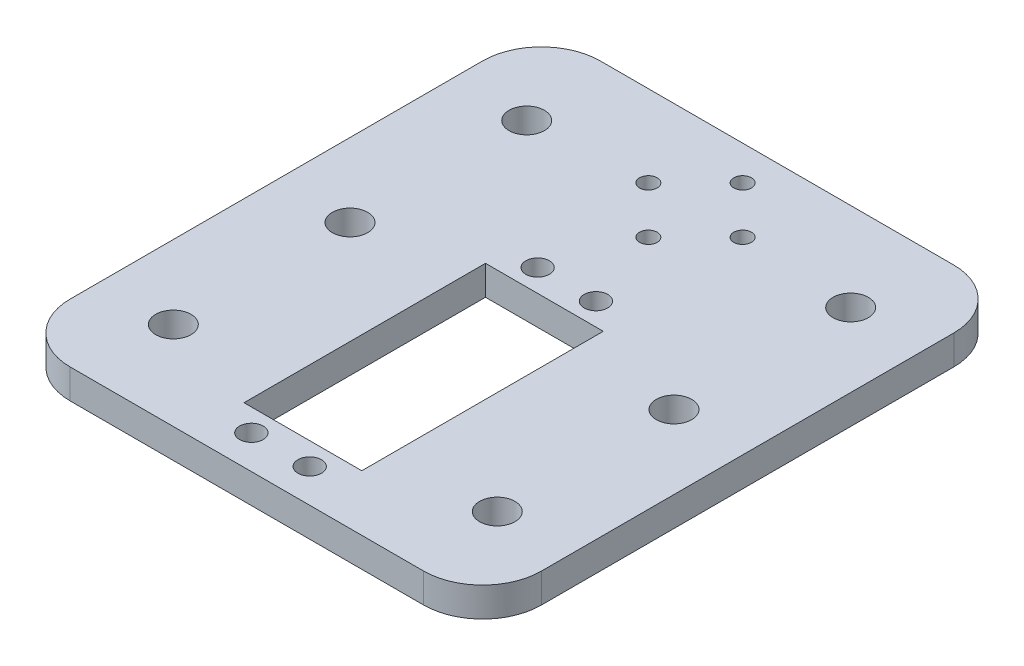
ISO-10303-21;
HEADER;
FILE_DESCRIPTION(('STEP AP214'),'2;1');
FILE_NAME('part.step','',(''),(''),'','','');
FILE_SCHEMA(('AUTOMOTIVE_DESIGN { 1 0 10303 214 1 1 1 1 }'));
ENDSEC;
DATA;
#1=APPLICATION_CONTEXT('core data for automotive mechanical design processes');
#2=APPLICATION_PROTOCOL_DEFINITION('international standard','automotive_design',2000,#1);
#3=PRODUCT_CONTEXT('',#1,'mechanical');
#4=PRODUCT('Part','Part','',(#3));
#5=PRODUCT_RELATED_PRODUCT_CATEGORY('part','',(#4));
#6=PRODUCT_DEFINITION_FORMATION('','',#4);
#7=PRODUCT_DEFINITION_CONTEXT('part definition',#1,'design');
#8=PRODUCT_DEFINITION('design','',#6,#7);
#9=PRODUCT_DEFINITION_SHAPE('','',#8);
#10=(LENGTH_UNIT() NAMED_UNIT(*) SI_UNIT(.MILLI.,.METRE.));
#11=(NAMED_UNIT(*) PLANE_ANGLE_UNIT() SI_UNIT($,.RADIAN.));
#12=(NAMED_UNIT(*) SI_UNIT($,.STERADIAN.) SOLID_ANGLE_UNIT());
#13=UNCERTAINTY_MEASURE_WITH_UNIT(LENGTH_MEASURE(1.E-05),#10,'distance_accuracy_value','');
#14=(GEOMETRIC_REPRESENTATION_CONTEXT(3) GLOBAL_UNCERTAINTY_ASSIGNED_CONTEXT((#13)) GLOBAL_UNIT_ASSIGNED_CONTEXT((#10,
#11,#12)) REPRESENTATION_CONTEXT('',''));
#15=CARTESIAN_POINT('',(0.,0.,0.));
#16=DIRECTION('',(0.,0.,1.));
#17=DIRECTION('',(1.,0.,0.));
#18=AXIS2_PLACEMENT_3D('',#15,#16,#17);
#19=CARTESIAN_POINT('',(0.,5.,0.));
#20=DIRECTION('',(0.,1.,0.));
#21=DIRECTION('',(0.,0.,1.));
#22=AXIS2_PLACEMENT_3D('',#19,#20,#21);
#23=PLANE('',#22);
#24=CARTESIAN_POINT('',(0.,5.,-54.15));
#25=DIRECTION('',(0.,1.,0.));
#26=DIRECTION('',(0.,0.,1.));
#27=AXIS2_PLACEMENT_3D('',#24,#25,#26);
#28=CIRCLE('',#27,1.5);
#29=CARTESIAN_POINT('',(0.,5.,-52.65));
#30=VERTEX_POINT('',#29);
#31=EDGE_CURVE('E613',#30,#30,#28,.T.);
#32=ORIENTED_EDGE('',*,*,#31,.F.);
#33=EDGE_LOOP('',(#32));
#34=FACE_BOUND('',#33,.T.);
#35=CARTESIAN_POINT('',(7.99999999999997,5.,-46.15));
#36=DIRECTION('',(0.,1.,0.));
#37=DIRECTION('',(0.,0.,1.));
#38=AXIS2_PLACEMENT_3D('',#35,#36,#37);
#39=CIRCLE('',#38,1.49999999999995);
#40=CARTESIAN_POINT('',(7.99999999999997,5.,-44.65));
#41=VERTEX_POINT('',#40);
#42=EDGE_CURVE('E640',#41,#41,#39,.T.);
#43=ORIENTED_EDGE('',*,*,#42,.F.);
#44=EDGE_LOOP('',(#43));
#45=FACE_BOUND('',#44,.T.);
#46=CARTESIAN_POINT('',(0.,5.,-38.15));
#47=DIRECTION('',(0.,1.,0.));
#48=DIRECTION('',(0.,0.,1.));
#49=AXIS2_PLACEMENT_3D('',#46,#47,#48);
#50=CIRCLE('',#49,1.49999999999984);
#51=CARTESIAN_POINT('',(0.,5.,-36.6500000000002));
#52=VERTEX_POINT('',#51);
#53=EDGE_CURVE('E634',#52,#52,#50,.T.);
#54=ORIENTED_EDGE('',*,*,#53,.F.);
#55=EDGE_LOOP('',(#54));
#56=FACE_BOUND('',#55,.T.);
#57=CARTESIAN_POINT('',(-8.00000000000004,5.,-46.15));
#58=DIRECTION('',(0.,1.,0.));
#59=DIRECTION('',(0.,0.,1.));
#60=AXIS2_PLACEMENT_3D('',#57,#58,#59);
#61=CIRCLE('',#60,1.49999999999995);
#62=CARTESIAN_POINT('',(-8.00000000000004,5.,-44.6500000000001));
#63=VERTEX_POINT('',#62);
#64=EDGE_CURVE('E628',#63,#63,#61,.T.);
#65=ORIENTED_EDGE('',*,*,#64,.F.);
#66=EDGE_LOOP('',(#65));
#67=FACE_BOUND('',#66,.T.);
#68=CARTESIAN_POINT('',(27.4999999999999,5.,-45.));
#69=DIRECTION('',(0.,1.,0.));
#70=DIRECTION('',(0.,0.,1.));
#71=AXIS2_PLACEMENT_3D('',#68,#69,#70);
#72=CIRCLE('',#71,3.);
#73=CARTESIAN_POINT('',(27.4999999999999,5.,-42.));
#74=VERTEX_POINT('',#73);
#75=EDGE_CURVE('E159',#74,#74,#72,.T.);
#76=ORIENTED_EDGE('',*,*,#75,.F.);
#77=EDGE_LOOP('',(#76));
#78=FACE_BOUND('',#77,.T.);
#79=CARTESIAN_POINT('',(4.95,5.,24.3));
#80=DIRECTION('',(0.,1.,0.));
#81=DIRECTION('',(0.,0.,-1.));
#82=AXIS2_PLACEMENT_3D('',#79,#80,#81);
#83=CIRCLE('',#82,2.);
#84=CARTESIAN_POINT('',(4.95,5.,22.3));
#85=VERTEX_POINT('',#84);
#86=EDGE_CURVE('E176',#85,#85,#83,.T.);
#87=ORIENTED_EDGE('',*,*,#86,.F.);
#88=EDGE_LOOP('',(#87));
#89=FACE_BOUND('',#88,.T.);
#90=CARTESIAN_POINT('',(4.95,5.,-24.3));
#91=DIRECTION('',(0.,1.,0.));
#92=DIRECTION('',(0.,0.,1.));
#93=AXIS2_PLACEMENT_3D('',#90,#91,#92);
#94=CIRCLE('',#93,2.);
#95=CARTESIAN_POINT('',(4.95,5.,-22.3));
#96=VERTEX_POINT('',#95);
#97=EDGE_CURVE('E188',#96,#96,#94,.T.);
#98=ORIENTED_EDGE('',*,*,#97,.F.);
#99=EDGE_LOOP('',(#98));
#100=FACE_BOUND('',#99,.T.);
#101=CARTESIAN_POINT('',(-27.5,5.,15.));
#102=DIRECTION('',(0.,1.,0.));
#103=DIRECTION('',(0.,0.,-1.));
#104=AXIS2_PLACEMENT_3D('',#101,#102,#103);
#105=CIRCLE('',#104,3.);
#106=CARTESIAN_POINT('',(-27.5,5.,12.));
#107=VERTEX_POINT('',#106);
#108=EDGE_CURVE('E200',#107,#107,#105,.T.);
#109=ORIENTED_EDGE('',*,*,#108,.F.);
#110=EDGE_LOOP('',(#109));
#111=FACE_BOUND('',#110,.T.);
#112=CARTESIAN_POINT('',(27.5,5.,-15.));
#113=DIRECTION('',(0.,1.,0.));
#114=DIRECTION('',(0.,0.,1.));
#115=AXIS2_PLACEMENT_3D('',#112,#113,#114);
#116=CIRCLE('',#115,3.);
#117=CARTESIAN_POINT('',(27.5,5.,-12.));
#118=VERTEX_POINT('',#117);
#119=EDGE_CURVE('E212',#118,#118,#116,.T.);
#120=ORIENTED_EDGE('',*,*,#119,.F.);
#121=EDGE_LOOP('',(#120));
#122=FACE_BOUND('',#121,.T.);
#123=DIRECTION('',(-1.,0.,0.));
#124=VECTOR('',#123,1.);
#125=CARTESIAN_POINT('',(-40.,5.,-60.));
#126=LINE('',#125,#124);
#127=CARTESIAN_POINT('',(30.,5.,-60.));
#128=VERTEX_POINT('',#127);
#129=CARTESIAN_POINT('',(-30.,5.,-60.));
#130=VERTEX_POINT('',#129);
#131=EDGE_CURVE('E218',#128,#130,#126,.T.);
#132=ORIENTED_EDGE('',*,*,#131,.T.);
#133=CARTESIAN_POINT('',(-30.,5.,-50.));
#134=DIRECTION('',(0.,1.,0.));
#135=DIRECTION('',(0.,0.,1.));
#136=AXIS2_PLACEMENT_3D('',#133,#134,#135);
#137=CIRCLE('',#136,10.);
#138=CARTESIAN_POINT('',(-40.,5.,-50.));
#139=VERTEX_POINT('',#138);
#140=EDGE_CURVE('E261',#130,#139,#137,.T.);
#141=ORIENTED_EDGE('',*,*,#140,.T.);
#142=DIRECTION('',(0.,0.,1.));
#143=VECTOR('',#142,1.);
#144=CARTESIAN_POINT('',(-40.,5.,30.));
#145=LINE('',#144,#143);
#146=CARTESIAN_POINT('',(-40.,5.,20.));
#147=VERTEX_POINT('',#146);
#148=EDGE_CURVE('E221',#139,#147,#145,.T.);
#149=ORIENTED_EDGE('',*,*,#148,.T.);
#150=CARTESIAN_POINT('',(-30.,5.,20.));
#151=DIRECTION('',(0.,1.,0.));
#152=DIRECTION('',(0.,0.,1.));
#153=AXIS2_PLACEMENT_3D('',#150,#151,#152);
#154=CIRCLE('',#153,10.);
#155=CARTESIAN_POINT('',(-30.,5.,30.));
#156=VERTEX_POINT('',#155);
#157=EDGE_CURVE('E256',#147,#156,#154,.T.);
#158=ORIENTED_EDGE('',*,*,#157,.T.);
#159=DIRECTION('',(1.,0.,0.));
#160=VECTOR('',#159,1.);
#161=CARTESIAN_POINT('',(-40.,5.,30.));
#162=LINE('',#161,#160);
#163=CARTESIAN_POINT('',(30.,5.,30.));
#164=VERTEX_POINT('',#163);
#165=EDGE_CURVE('E225',#156,#164,#162,.T.);
#166=ORIENTED_EDGE('',*,*,#165,.T.);
#167=CARTESIAN_POINT('',(30.,5.,20.));
#168=DIRECTION('',(0.,1.,0.));
#169=DIRECTION('',(0.,0.,1.));
#170=AXIS2_PLACEMENT_3D('',#167,#168,#169);
#171=CIRCLE('',#170,10.);
#172=CARTESIAN_POINT('',(40.,5.,20.));
#173=VERTEX_POINT('',#172);
#174=EDGE_CURVE('E57',#164,#173,#171,.T.);
#175=ORIENTED_EDGE('',*,*,#174,.T.);
#176=DIRECTION('',(0.,0.,-1.));
#177=VECTOR('',#176,1.);
#178=CARTESIAN_POINT('',(40.,5.,30.));
#179=LINE('',#178,#177);
#180=CARTESIAN_POINT('',(40.,5.,-50.));
#181=VERTEX_POINT('',#180);
#182=EDGE_CURVE('E227',#173,#181,#179,.T.);
#183=ORIENTED_EDGE('',*,*,#182,.T.);
#184=CARTESIAN_POINT('',(30.,5.,-50.));
#185=DIRECTION('',(0.,1.,0.));
#186=DIRECTION('',(0.,0.,1.));
#187=AXIS2_PLACEMENT_3D('',#184,#185,#186);
#188=CIRCLE('',#187,10.);
#189=EDGE_CURVE('E259',#181,#128,#188,.T.);
#190=ORIENTED_EDGE('',*,*,#189,.T.);
#191=EDGE_LOOP('',(#132,#141,#149,#158,#166,#175,#183,#190));
#192=FACE_BOUND('',#191,.T.);
#193=CARTESIAN_POINT('',(27.5,5.,15.));
#194=DIRECTION('',(0.,1.,0.));
#195=DIRECTION('',(0.,0.,1.));
#196=AXIS2_PLACEMENT_3D('',#193,#194,#195);
#197=CIRCLE('',#196,3.);
#198=CARTESIAN_POINT('',(27.5,5.,18.));
#199=VERTEX_POINT('',#198);
#200=EDGE_CURVE('E206',#199,#199,#197,.T.);
#201=ORIENTED_EDGE('',*,*,#200,.F.);
#202=EDGE_LOOP('',(#201));
#203=FACE_BOUND('',#202,.T.);
#204=CARTESIAN_POINT('',(-27.5,5.,-15.));
#205=DIRECTION('',(0.,1.,0.));
#206=DIRECTION('',(0.,0.,-1.));
#207=AXIS2_PLACEMENT_3D('',#204,#205,#206);
#208=CIRCLE('',#207,3.);
#209=CARTESIAN_POINT('',(-27.5,5.,-18.));
#210=VERTEX_POINT('',#209);
#211=EDGE_CURVE('E194',#210,#210,#208,.T.);
#212=ORIENTED_EDGE('',*,*,#211,.F.);
#213=EDGE_LOOP('',(#212));
#214=FACE_BOUND('',#213,.T.);
#215=CARTESIAN_POINT('',(-4.95,5.,-24.3));
#216=DIRECTION('',(0.,1.,0.));
#217=DIRECTION('',(0.,0.,-1.));
#218=AXIS2_PLACEMENT_3D('',#215,#216,#217);
#219=CIRCLE('',#218,2.);
#220=CARTESIAN_POINT('',(-4.95,5.,-26.3));
#221=VERTEX_POINT('',#220);
#222=EDGE_CURVE('E182',#221,#221,#219,.T.);
#223=ORIENTED_EDGE('',*,*,#222,.F.);
#224=EDGE_LOOP('',(#223));
#225=FACE_BOUND('',#224,.T.);
#226=CARTESIAN_POINT('',(-4.95,5.,24.3));
#227=DIRECTION('',(0.,1.,0.));
#228=DIRECTION('',(0.,0.,1.));
#229=AXIS2_PLACEMENT_3D('',#226,#227,#228);
#230=CIRCLE('',#229,2.);
#231=CARTESIAN_POINT('',(-4.95,5.,26.3));
#232=VERTEX_POINT('',#231);
#233=EDGE_CURVE('E170',#232,#232,#230,.T.);
#234=ORIENTED_EDGE('',*,*,#233,.F.);
#235=EDGE_LOOP('',(#234));
#236=FACE_BOUND('',#235,.T.);
#237=DIRECTION('',(-1.,0.,0.));
#238=VECTOR('',#237,1.);
#239=CARTESIAN_POINT('',(-10.,5.,-20.5));
#240=LINE('',#239,#238);
#241=CARTESIAN_POINT('',(10.,5.,-20.5));
#242=VERTEX_POINT('',#241);
#243=CARTESIAN_POINT('',(-10.,5.,-20.5));
#244=VERTEX_POINT('',#243);
#245=EDGE_CURVE('E136',#242,#244,#240,.T.);
#246=ORIENTED_EDGE('',*,*,#245,.F.);
#247=DIRECTION('',(0.,0.,-1.));
#248=VECTOR('',#247,1.);
#249=CARTESIAN_POINT('',(10.,5.,20.5));
#250=LINE('',#249,#248);
#251=CARTESIAN_POINT('',(10.,5.,20.5));
#252=VERTEX_POINT('',#251);
#253=EDGE_CURVE('E126',#252,#242,#250,.T.);
#254=ORIENTED_EDGE('',*,*,#253,.F.);
#255=DIRECTION('',(1.,0.,0.));
#256=VECTOR('',#255,1.);
#257=CARTESIAN_POINT('',(-10.,5.,20.5));
#258=LINE('',#257,#256);
#259=CARTESIAN_POINT('',(-10.,5.,20.5));
#260=VERTEX_POINT('',#259);
#261=EDGE_CURVE('E152',#260,#252,#258,.T.);
#262=ORIENTED_EDGE('',*,*,#261,.F.);
#263=DIRECTION('',(0.,0.,1.));
#264=VECTOR('',#263,1.);
#265=CARTESIAN_POINT('',(-10.,5.,20.5));
#266=LINE('',#265,#264);
#267=EDGE_CURVE('E150',#244,#260,#266,.T.);
#268=ORIENTED_EDGE('',*,*,#267,.F.);
#269=EDGE_LOOP('',(#246,#254,#262,#268));
#270=FACE_BOUND('',#269,.T.);
#271=CARTESIAN_POINT('',(-27.5000000000001,5.,-45.));
#272=DIRECTION('',(0.,1.,0.));
#273=DIRECTION('',(0.,0.,-1.));
#274=AXIS2_PLACEMENT_3D('',#271,#272,#273);
#275=CIRCLE('',#274,3.);
#276=CARTESIAN_POINT('',(-27.5000000000001,5.,-48.));
#277=VERTEX_POINT('',#276);
#278=EDGE_CURVE('E612',#277,#277,#275,.T.);
#279=ORIENTED_EDGE('',*,*,#278,.F.);
#280=EDGE_LOOP('',(#279));
#281=FACE_BOUND('',#280,.T.);
#282=ADVANCED_FACE('F35',(#34,#45,#56,#67,#78,#89,#100,#111,#122,#192,#203,#214,#225,#236,#270,
#281),#23,.T.);
#283=CARTESIAN_POINT('',(0.,0.,0.));
#284=DIRECTION('',(0.,1.,0.));
#285=DIRECTION('',(0.,0.,1.));
#286=AXIS2_PLACEMENT_3D('',#283,#284,#285);
#287=PLANE('',#286);
#288=CARTESIAN_POINT('',(0.,0.,-54.15));
#289=DIRECTION('',(0.,1.,0.));
#290=DIRECTION('',(0.,0.,1.));
#291=AXIS2_PLACEMENT_3D('',#288,#289,#290);
#292=CIRCLE('',#291,1.5);
#293=CARTESIAN_POINT('',(0.,0.,-52.65));
#294=VERTEX_POINT('',#293);
#295=EDGE_CURVE('E617',#294,#294,#292,.T.);
#296=ORIENTED_EDGE('',*,*,#295,.T.);
#297=EDGE_LOOP('',(#296));
#298=FACE_BOUND('',#297,.T.);
#299=CARTESIAN_POINT('',(7.99999999999997,0.,-46.15));
#300=DIRECTION('',(0.,1.,0.));
#301=DIRECTION('',(0.,0.,1.));
#302=AXIS2_PLACEMENT_3D('',#299,#300,#301);
#303=CIRCLE('',#302,1.49999999999995);
#304=CARTESIAN_POINT('',(7.99999999999997,0.,-44.65));
#305=VERTEX_POINT('',#304);
#306=EDGE_CURVE('E637',#305,#305,#303,.T.);
#307=ORIENTED_EDGE('',*,*,#306,.T.);
#308=EDGE_LOOP('',(#307));
#309=FACE_BOUND('',#308,.T.);
#310=CARTESIAN_POINT('',(0.,0.,-38.15));
#311=DIRECTION('',(0.,1.,0.));
#312=DIRECTION('',(0.,0.,1.));
#313=AXIS2_PLACEMENT_3D('',#310,#311,#312);
#314=CIRCLE('',#313,1.49999999999984);
#315=CARTESIAN_POINT('',(0.,0.,-36.6500000000002));
#316=VERTEX_POINT('',#315);
#317=EDGE_CURVE('E631',#316,#316,#314,.T.);
#318=ORIENTED_EDGE('',*,*,#317,.T.);
#319=EDGE_LOOP('',(#318));
#320=FACE_BOUND('',#319,.T.);
#321=CARTESIAN_POINT('',(-8.00000000000004,0.,-46.15));
#322=DIRECTION('',(0.,1.,0.));
#323=DIRECTION('',(0.,0.,1.));
#324=AXIS2_PLACEMENT_3D('',#321,#322,#323);
#325=CIRCLE('',#324,1.49999999999995);
#326=CARTESIAN_POINT('',(-8.00000000000004,0.,-44.6500000000001));
#327=VERTEX_POINT('',#326);
#328=EDGE_CURVE('E625',#327,#327,#325,.T.);
#329=ORIENTED_EDGE('',*,*,#328,.T.);
#330=EDGE_LOOP('',(#329));
#331=FACE_BOUND('',#330,.T.);
#332=CARTESIAN_POINT('',(-4.95,0.,24.3));
#333=DIRECTION('',(0.,1.,0.));
#334=DIRECTION('',(0.,0.,1.));
#335=AXIS2_PLACEMENT_3D('',#332,#333,#334);
#336=CIRCLE('',#335,2.);
#337=CARTESIAN_POINT('',(-4.95,0.,26.3));
#338=VERTEX_POINT('',#337);
#339=EDGE_CURVE('E144',#338,#338,#336,.T.);
#340=ORIENTED_EDGE('',*,*,#339,.T.);
#341=EDGE_LOOP('',(#340));
#342=FACE_BOUND('',#341,.T.);
#343=CARTESIAN_POINT('',(4.95,0.,24.3));
#344=DIRECTION('',(0.,1.,0.));
#345=DIRECTION('',(0.,0.,-1.));
#346=AXIS2_PLACEMENT_3D('',#343,#344,#345);
#347=CIRCLE('',#346,2.);
#348=CARTESIAN_POINT('',(4.95,0.,22.3));
#349=VERTEX_POINT('',#348);
#350=EDGE_CURVE('E173',#349,#349,#347,.T.);
#351=ORIENTED_EDGE('',*,*,#350,.T.);
#352=EDGE_LOOP('',(#351));
#353=FACE_BOUND('',#352,.T.);
#354=CARTESIAN_POINT('',(-4.95,0.,-24.3));
#355=DIRECTION('',(0.,1.,0.));
#356=DIRECTION('',(0.,0.,-1.));
#357=AXIS2_PLACEMENT_3D('',#354,#355,#356);
#358=CIRCLE('',#357,2.);
#359=CARTESIAN_POINT('',(-4.95,0.,-26.3));
#360=VERTEX_POINT('',#359);
#361=EDGE_CURVE('E179',#360,#360,#358,.T.);
#362=ORIENTED_EDGE('',*,*,#361,.T.);
#363=EDGE_LOOP('',(#362));
#364=FACE_BOUND('',#363,.T.);
#365=CARTESIAN_POINT('',(4.95,0.,-24.3));
#366=DIRECTION('',(0.,1.,0.));
#367=DIRECTION('',(0.,0.,1.));
#368=AXIS2_PLACEMENT_3D('',#365,#366,#367);
#369=CIRCLE('',#368,2.);
#370=CARTESIAN_POINT('',(4.95,0.,-22.3));
#371=VERTEX_POINT('',#370);
#372=EDGE_CURVE('E185',#371,#371,#369,.T.);
#373=ORIENTED_EDGE('',*,*,#372,.T.);
#374=EDGE_LOOP('',(#373));
#375=FACE_BOUND('',#374,.T.);
#376=CARTESIAN_POINT('',(-27.5,0.,-15.));
#377=DIRECTION('',(0.,1.,0.));
#378=DIRECTION('',(0.,0.,-1.));
#379=AXIS2_PLACEMENT_3D('',#376,#377,#378);
#380=CIRCLE('',#379,3.);
#381=CARTESIAN_POINT('',(-27.5,0.,-18.));
#382=VERTEX_POINT('',#381);
#383=EDGE_CURVE('E191',#382,#382,#380,.T.);
#384=ORIENTED_EDGE('',*,*,#383,.T.);
#385=EDGE_LOOP('',(#384));
#386=FACE_BOUND('',#385,.T.);
#387=CARTESIAN_POINT('',(-27.5,0.,15.));
#388=DIRECTION('',(0.,1.,0.));
#389=DIRECTION('',(0.,0.,-1.));
#390=AXIS2_PLACEMENT_3D('',#387,#388,#389);
#391=CIRCLE('',#390,3.);
#392=CARTESIAN_POINT('',(-27.5,0.,12.));
#393=VERTEX_POINT('',#392);
#394=EDGE_CURVE('E197',#393,#393,#391,.T.);
#395=ORIENTED_EDGE('',*,*,#394,.T.);
#396=EDGE_LOOP('',(#395));
#397=FACE_BOUND('',#396,.T.);
#398=CARTESIAN_POINT('',(27.5,0.,15.));
#399=DIRECTION('',(0.,1.,0.));
#400=DIRECTION('',(0.,0.,1.));
#401=AXIS2_PLACEMENT_3D('',#398,#399,#400);
#402=CIRCLE('',#401,3.);
#403=CARTESIAN_POINT('',(27.5,0.,18.));
#404=VERTEX_POINT('',#403);
#405=EDGE_CURVE('E203',#404,#404,#402,.T.);
#406=ORIENTED_EDGE('',*,*,#405,.T.);
#407=EDGE_LOOP('',(#406));
#408=FACE_BOUND('',#407,.T.);
#409=CARTESIAN_POINT('',(27.5,0.,-15.));
#410=DIRECTION('',(0.,1.,0.));
#411=DIRECTION('',(0.,0.,1.));
#412=AXIS2_PLACEMENT_3D('',#409,#410,#411);
#413=CIRCLE('',#412,3.);
#414=CARTESIAN_POINT('',(27.5,0.,-12.));
#415=VERTEX_POINT('',#414);
#416=EDGE_CURVE('E209',#415,#415,#413,.T.);
#417=ORIENTED_EDGE('',*,*,#416,.T.);
#418=EDGE_LOOP('',(#417));
#419=FACE_BOUND('',#418,.T.);
#420=DIRECTION('',(0.,0.,1.));
#421=VECTOR('',#420,1.);
#422=CARTESIAN_POINT('',(-40.,0.,30.));
#423=LINE('',#422,#421);
#424=CARTESIAN_POINT('',(-40.,0.,-50.));
#425=VERTEX_POINT('',#424);
#426=CARTESIAN_POINT('',(-40.,0.,20.));
#427=VERTEX_POINT('',#426);
#428=EDGE_CURVE('E232',#425,#427,#423,.T.);
#429=ORIENTED_EDGE('',*,*,#428,.F.);
#430=CARTESIAN_POINT('',(-30.,0.,-50.));
#431=DIRECTION('',(0.,1.,0.));
#432=DIRECTION('',(0.,0.,1.));
#433=AXIS2_PLACEMENT_3D('',#430,#431,#432);
#434=CIRCLE('',#433,10.);
#435=CARTESIAN_POINT('',(-30.,0.,-60.));
#436=VERTEX_POINT('',#435);
#437=EDGE_CURVE('E249',#425,#436,#434,.F.);
#438=ORIENTED_EDGE('',*,*,#437,.T.);
#439=DIRECTION('',(-1.,0.,0.));
#440=VECTOR('',#439,1.);
#441=CARTESIAN_POINT('',(-40.,0.,-60.));
#442=LINE('',#441,#440);
#443=CARTESIAN_POINT('',(30.,0.,-60.));
#444=VERTEX_POINT('',#443);
#445=EDGE_CURVE('E215',#444,#436,#442,.T.);
#446=ORIENTED_EDGE('',*,*,#445,.F.);
#447=CARTESIAN_POINT('',(30.,0.,-50.));
#448=DIRECTION('',(0.,1.,0.));
#449=DIRECTION('',(0.,0.,1.));
#450=AXIS2_PLACEMENT_3D('',#447,#448,#449);
#451=CIRCLE('',#450,10.);
#452=CARTESIAN_POINT('',(40.,0.,-50.));
#453=VERTEX_POINT('',#452);
#454=EDGE_CURVE('E247',#444,#453,#451,.F.);
#455=ORIENTED_EDGE('',*,*,#454,.T.);
#456=DIRECTION('',(0.,0.,-1.));
#457=VECTOR('',#456,1.);
#458=CARTESIAN_POINT('',(40.,0.,30.));
#459=LINE('',#458,#457);
#460=CARTESIAN_POINT('',(40.,0.,20.));
#461=VERTEX_POINT('',#460);
#462=EDGE_CURVE('E222',#461,#453,#459,.T.);
#463=ORIENTED_EDGE('',*,*,#462,.F.);
#464=CARTESIAN_POINT('',(30.,0.,20.));
#465=DIRECTION('',(0.,1.,0.));
#466=DIRECTION('',(0.,0.,1.));
#467=AXIS2_PLACEMENT_3D('',#464,#465,#466);
#468=CIRCLE('',#467,10.);
#469=CARTESIAN_POINT('',(30.,0.,30.));
#470=VERTEX_POINT('',#469);
#471=EDGE_CURVE('E245',#461,#470,#468,.F.);
#472=ORIENTED_EDGE('',*,*,#471,.T.);
#473=DIRECTION('',(1.,0.,0.));
#474=VECTOR('',#473,1.);
#475=CARTESIAN_POINT('',(-40.,0.,30.));
#476=LINE('',#475,#474);
#477=CARTESIAN_POINT('',(-30.,0.,30.));
#478=VERTEX_POINT('',#477);
#479=EDGE_CURVE('E235',#478,#470,#476,.T.);
#480=ORIENTED_EDGE('',*,*,#479,.F.);
#481=CARTESIAN_POINT('',(-30.,0.,20.));
#482=DIRECTION('',(0.,1.,0.));
#483=DIRECTION('',(0.,0.,1.));
#484=AXIS2_PLACEMENT_3D('',#481,#482,#483);
#485=CIRCLE('',#484,10.);
#486=EDGE_CURVE('E243',#478,#427,#485,.F.);
#487=ORIENTED_EDGE('',*,*,#486,.T.);
#488=EDGE_LOOP('',(#429,#438,#446,#455,#463,#472,#480,#487));
#489=FACE_BOUND('',#488,.T.);
#490=DIRECTION('',(0.,0.,-1.));
#491=VECTOR('',#490,1.);
#492=CARTESIAN_POINT('',(10.,0.,20.5));
#493=LINE('',#492,#491);
#494=CARTESIAN_POINT('',(10.,0.,20.5));
#495=VERTEX_POINT('',#494);
#496=CARTESIAN_POINT('',(10.,0.,-20.5));
#497=VERTEX_POINT('',#496);
#498=EDGE_CURVE('E157',#495,#497,#493,.T.);
#499=ORIENTED_EDGE('',*,*,#498,.T.);
#500=DIRECTION('',(-1.,0.,0.));
#501=VECTOR('',#500,1.);
#502=CARTESIAN_POINT('',(-10.,0.,-20.5));
#503=LINE('',#502,#501);
#504=CARTESIAN_POINT('',(-10.,0.,-20.5));
#505=VERTEX_POINT('',#504);
#506=EDGE_CURVE('E143',#497,#505,#503,.T.);
#507=ORIENTED_EDGE('',*,*,#506,.T.);
#508=DIRECTION('',(0.,0.,1.));
#509=VECTOR('',#508,1.);
#510=CARTESIAN_POINT('',(-10.,0.,20.5));
#511=LINE('',#510,#509);
#512=CARTESIAN_POINT('',(-10.,0.,20.5));
#513=VERTEX_POINT('',#512);
#514=EDGE_CURVE('E161',#505,#513,#511,.T.);
#515=ORIENTED_EDGE('',*,*,#514,.T.);
#516=DIRECTION('',(1.,0.,0.));
#517=VECTOR('',#516,1.);
#518=CARTESIAN_POINT('',(-10.,0.,20.5));
#519=LINE('',#518,#517);
#520=EDGE_CURVE('E137',#513,#495,#519,.T.);
#521=ORIENTED_EDGE('',*,*,#520,.T.);
#522=EDGE_LOOP('',(#499,#507,#515,#521));
#523=FACE_BOUND('',#522,.T.);
#524=CARTESIAN_POINT('',(27.4999999999999,0.,-45.));
#525=DIRECTION('',(0.,1.,0.));
#526=DIRECTION('',(0.,0.,1.));
#527=AXIS2_PLACEMENT_3D('',#524,#525,#526);
#528=CIRCLE('',#527,3.);
#529=CARTESIAN_POINT('',(27.4999999999999,0.,-42.));
#530=VERTEX_POINT('',#529);
#531=EDGE_CURVE('E607',#530,#530,#528,.T.);
#532=ORIENTED_EDGE('',*,*,#531,.T.);
#533=EDGE_LOOP('',(#532));
#534=FACE_BOUND('',#533,.T.);
#535=CARTESIAN_POINT('',(-27.5000000000001,0.,-45.));
#536=DIRECTION('',(0.,1.,0.));
#537=DIRECTION('',(0.,0.,-1.));
#538=AXIS2_PLACEMENT_3D('',#535,#536,#537);
#539=CIRCLE('',#538,3.);
#540=CARTESIAN_POINT('',(-27.5000000000001,0.,-48.));
#541=VERTEX_POINT('',#540);
#542=EDGE_CURVE('E610',#541,#541,#539,.T.);
#543=ORIENTED_EDGE('',*,*,#542,.T.);
#544=EDGE_LOOP('',(#543));
#545=FACE_BOUND('',#544,.T.);
#546=ADVANCED_FACE('F277',(#298,#309,#320,#331,#342,#353,#364,#375,#386,#397,#408,#419,#489,
#523,#534,#545),#287,.F.);
#547=CARTESIAN_POINT('',(-40.,5.,-60.));
#548=DIRECTION('',(0.,0.,1.));
#549=DIRECTION('',(1.,0.,0.));
#550=AXIS2_PLACEMENT_3D('',#547,#548,#549);
#551=PLANE('',#550);
#552=ORIENTED_EDGE('',*,*,#445,.T.);
#553=DIRECTION('',(0.,-1.,0.));
#554=VECTOR('',#553,1.);
#555=CARTESIAN_POINT('',(-30.,5.,-60.));
#556=LINE('',#555,#554);
#557=EDGE_CURVE('E254',#436,#130,#556,.F.);
#558=ORIENTED_EDGE('',*,*,#557,.T.);
#559=ORIENTED_EDGE('',*,*,#131,.F.);
#560=DIRECTION('',(0.,-1.,0.));
#561=VECTOR('',#560,1.);
#562=CARTESIAN_POINT('',(30.,5.,-60.));
#563=LINE('',#562,#561);
#564=EDGE_CURVE('E251',#128,#444,#563,.T.);
#565=ORIENTED_EDGE('',*,*,#564,.T.);
#566=EDGE_LOOP('',(#552,#558,#559,#565));
#567=FACE_BOUND('',#566,.T.);
#568=ADVANCED_FACE('F292',(#567),#551,.F.);
#569=CARTESIAN_POINT('',(-40.,5.,30.));
#570=DIRECTION('',(1.,0.,0.));
#571=DIRECTION('',(0.,0.,-1.));
#572=AXIS2_PLACEMENT_3D('',#569,#570,#571);
#573=PLANE('',#572);
#574=ORIENTED_EDGE('',*,*,#148,.F.);
#575=DIRECTION('',(0.,-1.,0.));
#576=VECTOR('',#575,1.);
#577=CARTESIAN_POINT('',(-40.,5.,-50.));
#578=LINE('',#577,#576);
#579=EDGE_CURVE('E240',#139,#425,#578,.T.);
#580=ORIENTED_EDGE('',*,*,#579,.T.);
#581=ORIENTED_EDGE('',*,*,#428,.T.);
#582=DIRECTION('',(0.,-1.,0.));
#583=VECTOR('',#582,1.);
#584=CARTESIAN_POINT('',(-40.,5.,20.));
#585=LINE('',#584,#583);
#586=EDGE_CURVE('E229',#427,#147,#585,.F.);
#587=ORIENTED_EDGE('',*,*,#586,.T.);
#588=EDGE_LOOP('',(#574,#580,#581,#587));
#589=FACE_BOUND('',#588,.T.);
#590=ADVANCED_FACE('F300',(#589),#573,.F.);
#591=CARTESIAN_POINT('',(-40.,5.,30.));
#592=DIRECTION('',(0.,0.,-1.));
#593=DIRECTION('',(-1.,0.,0.));
#594=AXIS2_PLACEMENT_3D('',#591,#592,#593);
#595=PLANE('',#594);
#596=ORIENTED_EDGE('',*,*,#479,.T.);
#597=DIRECTION('',(0.,-1.,0.));
#598=VECTOR('',#597,1.);
#599=CARTESIAN_POINT('',(30.,5.,30.));
#600=LINE('',#599,#598);
#601=EDGE_CURVE('E11',#470,#164,#600,.F.);
#602=ORIENTED_EDGE('',*,*,#601,.T.);
#603=ORIENTED_EDGE('',*,*,#165,.F.);
#604=DIRECTION('',(0.,-1.,0.));
#605=VECTOR('',#604,1.);
#606=CARTESIAN_POINT('',(-30.,5.,30.));
#607=LINE('',#606,#605);
#608=EDGE_CURVE('E43',#156,#478,#607,.T.);
#609=ORIENTED_EDGE('',*,*,#608,.T.);
#610=EDGE_LOOP('',(#596,#602,#603,#609));
#611=FACE_BOUND('',#610,.T.);
#612=ADVANCED_FACE('F271',(#611),#595,.F.);
#613=CARTESIAN_POINT('',(40.,5.,30.));
#614=DIRECTION('',(-1.,0.,0.));
#615=DIRECTION('',(0.,0.,1.));
#616=AXIS2_PLACEMENT_3D('',#613,#614,#615);
#617=PLANE('',#616);
#618=ORIENTED_EDGE('',*,*,#462,.T.);
#619=DIRECTION('',(0.,-1.,0.));
#620=VECTOR('',#619,1.);
#621=CARTESIAN_POINT('',(40.,5.,-50.));
#622=LINE('',#621,#620);
#623=EDGE_CURVE('E50',#453,#181,#622,.F.);
#624=ORIENTED_EDGE('',*,*,#623,.T.);
#625=ORIENTED_EDGE('',*,*,#182,.F.);
#626=DIRECTION('',(0.,-1.,0.));
#627=VECTOR('',#626,1.);
#628=CARTESIAN_POINT('',(40.,5.,20.));
#629=LINE('',#628,#627);
#630=EDGE_CURVE('E263',#173,#461,#629,.T.);
#631=ORIENTED_EDGE('',*,*,#630,.T.);
#632=EDGE_LOOP('',(#618,#624,#625,#631));
#633=FACE_BOUND('',#632,.T.);
#634=ADVANCED_FACE('F283',(#633),#617,.F.);
#635=CARTESIAN_POINT('',(27.5,5.,-15.));
#636=DIRECTION('',(0.,-1.,0.));
#637=DIRECTION('',(0.,0.,-1.));
#638=AXIS2_PLACEMENT_3D('',#635,#636,#637);
#639=CYLINDRICAL_SURFACE('',#638,3.);
#640=ORIENTED_EDGE('',*,*,#119,.T.);
#641=EDGE_LOOP('',(#640));
#642=FACE_BOUND('',#641,.T.);
#643=ORIENTED_EDGE('',*,*,#416,.F.);
#644=EDGE_LOOP('',(#643));
#645=FACE_BOUND('',#644,.T.);
#646=ADVANCED_FACE('F322',(#642,#645),#639,.F.);
#647=CARTESIAN_POINT('',(27.5,5.,15.));
#648=DIRECTION('',(0.,-1.,0.));
#649=DIRECTION('',(0.,0.,-1.));
#650=AXIS2_PLACEMENT_3D('',#647,#648,#649);
#651=CYLINDRICAL_SURFACE('',#650,3.);
#652=ORIENTED_EDGE('',*,*,#200,.T.);
#653=EDGE_LOOP('',(#652));
#654=FACE_BOUND('',#653,.T.);
#655=ORIENTED_EDGE('',*,*,#405,.F.);
#656=EDGE_LOOP('',(#655));
#657=FACE_BOUND('',#656,.T.);
#658=ADVANCED_FACE('F443',(#654,#657),#651,.F.);
#659=CARTESIAN_POINT('',(-27.5,5.,15.));
#660=DIRECTION('',(0.,-1.,0.));
#661=DIRECTION('',(0.,0.,-1.));
#662=AXIS2_PLACEMENT_3D('',#659,#660,#661);
#663=CYLINDRICAL_SURFACE('',#662,3.);
#664=ORIENTED_EDGE('',*,*,#108,.T.);
#665=EDGE_LOOP('',(#664));
#666=FACE_BOUND('',#665,.T.);
#667=ORIENTED_EDGE('',*,*,#394,.F.);
#668=EDGE_LOOP('',(#667));
#669=FACE_BOUND('',#668,.T.);
#670=ADVANCED_FACE('F440',(#666,#669),#663,.F.);
#671=CARTESIAN_POINT('',(-27.5,5.,-15.));
#672=DIRECTION('',(0.,-1.,0.));
#673=DIRECTION('',(0.,0.,-1.));
#674=AXIS2_PLACEMENT_3D('',#671,#672,#673);
#675=CYLINDRICAL_SURFACE('',#674,3.);
#676=ORIENTED_EDGE('',*,*,#211,.T.);
#677=EDGE_LOOP('',(#676));
#678=FACE_BOUND('',#677,.T.);
#679=ORIENTED_EDGE('',*,*,#383,.F.);
#680=EDGE_LOOP('',(#679));
#681=FACE_BOUND('',#680,.T.);
#682=ADVANCED_FACE('F436',(#678,#681),#675,.F.);
#683=CARTESIAN_POINT('',(4.95,5.,-24.3));
#684=DIRECTION('',(0.,-1.,0.));
#685=DIRECTION('',(0.,0.,-1.));
#686=AXIS2_PLACEMENT_3D('',#683,#684,#685);
#687=CYLINDRICAL_SURFACE('',#686,2.);
#688=ORIENTED_EDGE('',*,*,#97,.T.);
#689=EDGE_LOOP('',(#688));
#690=FACE_BOUND('',#689,.T.);
#691=ORIENTED_EDGE('',*,*,#372,.F.);
#692=EDGE_LOOP('',(#691));
#693=FACE_BOUND('',#692,.T.);
#694=ADVANCED_FACE('F432',(#690,#693),#687,.F.);
#695=CARTESIAN_POINT('',(-4.95,5.,-24.3));
#696=DIRECTION('',(0.,-1.,0.));
#697=DIRECTION('',(0.,0.,-1.));
#698=AXIS2_PLACEMENT_3D('',#695,#696,#697);
#699=CYLINDRICAL_SURFACE('',#698,2.);
#700=ORIENTED_EDGE('',*,*,#222,.T.);
#701=EDGE_LOOP('',(#700));
#702=FACE_BOUND('',#701,.T.);
#703=ORIENTED_EDGE('',*,*,#361,.F.);
#704=EDGE_LOOP('',(#703));
#705=FACE_BOUND('',#704,.T.);
#706=ADVANCED_FACE('F428',(#702,#705),#699,.F.);
#707=CARTESIAN_POINT('',(4.95,5.,24.3));
#708=DIRECTION('',(0.,-1.,0.));
#709=DIRECTION('',(0.,0.,-1.));
#710=AXIS2_PLACEMENT_3D('',#707,#708,#709);
#711=CYLINDRICAL_SURFACE('',#710,2.);
#712=ORIENTED_EDGE('',*,*,#86,.T.);
#713=EDGE_LOOP('',(#712));
#714=FACE_BOUND('',#713,.T.);
#715=ORIENTED_EDGE('',*,*,#350,.F.);
#716=EDGE_LOOP('',(#715));
#717=FACE_BOUND('',#716,.T.);
#718=ADVANCED_FACE('F424',(#714,#717),#711,.F.);
#719=CARTESIAN_POINT('',(-4.95,5.,24.3));
#720=DIRECTION('',(0.,-1.,0.));
#721=DIRECTION('',(0.,0.,-1.));
#722=AXIS2_PLACEMENT_3D('',#719,#720,#721);
#723=CYLINDRICAL_SURFACE('',#722,2.);
#724=ORIENTED_EDGE('',*,*,#233,.T.);
#725=EDGE_LOOP('',(#724));
#726=FACE_BOUND('',#725,.T.);
#727=ORIENTED_EDGE('',*,*,#339,.F.);
#728=EDGE_LOOP('',(#727));
#729=FACE_BOUND('',#728,.T.);
#730=ADVANCED_FACE('F421',(#726,#729),#723,.F.);
#731=CARTESIAN_POINT('',(10.,5.,20.5));
#732=DIRECTION('',(-1.,0.,0.));
#733=DIRECTION('',(0.,0.,1.));
#734=AXIS2_PLACEMENT_3D('',#731,#732,#733);
#735=PLANE('',#734);
#736=ORIENTED_EDGE('',*,*,#498,.F.);
#737=DIRECTION('',(0.,-1.,0.));
#738=VECTOR('',#737,1.);
#739=CARTESIAN_POINT('',(10.,5.,20.5));
#740=LINE('',#739,#738);
#741=EDGE_CURVE('E132',#252,#495,#740,.T.);
#742=ORIENTED_EDGE('',*,*,#741,.F.);
#743=ORIENTED_EDGE('',*,*,#253,.T.);
#744=DIRECTION('',(0.,-1.,0.));
#745=VECTOR('',#744,1.);
#746=CARTESIAN_POINT('',(10.,5.,-20.5));
#747=LINE('',#746,#745);
#748=EDGE_CURVE('E129',#242,#497,#747,.T.);
#749=ORIENTED_EDGE('',*,*,#748,.T.);
#750=EDGE_LOOP('',(#736,#742,#743,#749));
#751=FACE_BOUND('',#750,.T.);
#752=ADVANCED_FACE('F128',(#751),#735,.T.);
#753=CARTESIAN_POINT('',(-10.,5.,-20.5));
#754=DIRECTION('',(0.,0.,1.));
#755=DIRECTION('',(1.,0.,0.));
#756=AXIS2_PLACEMENT_3D('',#753,#754,#755);
#757=PLANE('',#756);
#758=ORIENTED_EDGE('',*,*,#506,.F.);
#759=ORIENTED_EDGE('',*,*,#748,.F.);
#760=ORIENTED_EDGE('',*,*,#245,.T.);
#761=DIRECTION('',(0.,-1.,0.));
#762=VECTOR('',#761,1.);
#763=CARTESIAN_POINT('',(-10.,5.,-20.5));
#764=LINE('',#763,#762);
#765=EDGE_CURVE('E145',#244,#505,#764,.T.);
#766=ORIENTED_EDGE('',*,*,#765,.T.);
#767=EDGE_LOOP('',(#758,#759,#760,#766));
#768=FACE_BOUND('',#767,.T.);
#769=ADVANCED_FACE('F140',(#768),#757,.T.);
#770=CARTESIAN_POINT('',(-10.,5.,20.5));
#771=DIRECTION('',(1.,0.,0.));
#772=DIRECTION('',(0.,0.,-1.));
#773=AXIS2_PLACEMENT_3D('',#770,#771,#772);
#774=PLANE('',#773);
#775=ORIENTED_EDGE('',*,*,#514,.F.);
#776=ORIENTED_EDGE('',*,*,#765,.F.);
#777=ORIENTED_EDGE('',*,*,#267,.T.);
#778=DIRECTION('',(0.,-1.,0.));
#779=VECTOR('',#778,1.);
#780=CARTESIAN_POINT('',(-10.,5.,20.5));
#781=LINE('',#780,#779);
#782=EDGE_CURVE('E167',#260,#513,#781,.T.);
#783=ORIENTED_EDGE('',*,*,#782,.T.);
#784=EDGE_LOOP('',(#775,#776,#777,#783));
#785=FACE_BOUND('',#784,.T.);
#786=ADVANCED_FACE('F412',(#785),#774,.T.);
#787=CARTESIAN_POINT('',(-10.,5.,20.5));
#788=DIRECTION('',(0.,0.,-1.));
#789=DIRECTION('',(-1.,0.,0.));
#790=AXIS2_PLACEMENT_3D('',#787,#788,#789);
#791=PLANE('',#790);
#792=ORIENTED_EDGE('',*,*,#520,.F.);
#793=ORIENTED_EDGE('',*,*,#782,.F.);
#794=ORIENTED_EDGE('',*,*,#261,.T.);
#795=ORIENTED_EDGE('',*,*,#741,.T.);
#796=EDGE_LOOP('',(#792,#793,#794,#795));
#797=FACE_BOUND('',#796,.T.);
#798=ADVANCED_FACE('F408',(#797),#791,.T.);
#799=CARTESIAN_POINT('',(27.4999999999999,5.,-45.));
#800=DIRECTION('',(0.,-1.,0.));
#801=DIRECTION('',(0.,0.,-1.));
#802=AXIS2_PLACEMENT_3D('',#799,#800,#801);
#803=CYLINDRICAL_SURFACE('',#802,3.);
#804=ORIENTED_EDGE('',*,*,#75,.T.);
#805=EDGE_LOOP('',(#804));
#806=FACE_BOUND('',#805,.T.);
#807=ORIENTED_EDGE('',*,*,#531,.F.);
#808=EDGE_LOOP('',(#807));
#809=FACE_BOUND('',#808,.T.);
#810=ADVANCED_FACE('F404',(#806,#809),#803,.F.);
#811=CARTESIAN_POINT('',(-27.5000000000001,5.,-45.));
#812=DIRECTION('',(0.,-1.,0.));
#813=DIRECTION('',(0.,0.,-1.));
#814=AXIS2_PLACEMENT_3D('',#811,#812,#813);
#815=CYLINDRICAL_SURFACE('',#814,3.);
#816=ORIENTED_EDGE('',*,*,#278,.T.);
#817=EDGE_LOOP('',(#816));
#818=FACE_BOUND('',#817,.T.);
#819=ORIENTED_EDGE('',*,*,#542,.F.);
#820=EDGE_LOOP('',(#819));
#821=FACE_BOUND('',#820,.T.);
#822=ADVANCED_FACE('F335',(#818,#821),#815,.F.);
#823=CARTESIAN_POINT('',(-30.,5.,-50.));
#824=DIRECTION('',(0.,-1.,0.));
#825=DIRECTION('',(0.,0.,-1.));
#826=AXIS2_PLACEMENT_3D('',#823,#824,#825);
#827=CYLINDRICAL_SURFACE('',#826,10.);
#828=ORIENTED_EDGE('',*,*,#140,.F.);
#829=ORIENTED_EDGE('',*,*,#557,.F.);
#830=ORIENTED_EDGE('',*,*,#437,.F.);
#831=ORIENTED_EDGE('',*,*,#579,.F.);
#832=EDGE_LOOP('',(#828,#829,#830,#831));
#833=FACE_BOUND('',#832,.T.);
#834=ADVANCED_FACE('F297',(#833),#827,.T.);
#835=CARTESIAN_POINT('',(30.,5.,-50.));
#836=DIRECTION('',(0.,-1.,0.));
#837=DIRECTION('',(0.,0.,-1.));
#838=AXIS2_PLACEMENT_3D('',#835,#836,#837);
#839=CYLINDRICAL_SURFACE('',#838,10.);
#840=ORIENTED_EDGE('',*,*,#189,.F.);
#841=ORIENTED_EDGE('',*,*,#623,.F.);
#842=ORIENTED_EDGE('',*,*,#454,.F.);
#843=ORIENTED_EDGE('',*,*,#564,.F.);
#844=EDGE_LOOP('',(#840,#841,#842,#843));
#845=FACE_BOUND('',#844,.T.);
#846=ADVANCED_FACE('F289',(#845),#839,.T.);
#847=CARTESIAN_POINT('',(30.,5.,20.));
#848=DIRECTION('',(0.,-1.,0.));
#849=DIRECTION('',(0.,0.,-1.));
#850=AXIS2_PLACEMENT_3D('',#847,#848,#849);
#851=CYLINDRICAL_SURFACE('',#850,10.);
#852=ORIENTED_EDGE('',*,*,#174,.F.);
#853=ORIENTED_EDGE('',*,*,#601,.F.);
#854=ORIENTED_EDGE('',*,*,#471,.F.);
#855=ORIENTED_EDGE('',*,*,#630,.F.);
#856=EDGE_LOOP('',(#852,#853,#854,#855));
#857=FACE_BOUND('',#856,.T.);
#858=ADVANCED_FACE('F282',(#857),#851,.T.);
#859=CARTESIAN_POINT('',(-30.,5.,20.));
#860=DIRECTION('',(0.,-1.,0.));
#861=DIRECTION('',(0.,0.,-1.));
#862=AXIS2_PLACEMENT_3D('',#859,#860,#861);
#863=CYLINDRICAL_SURFACE('',#862,10.);
#864=ORIENTED_EDGE('',*,*,#157,.F.);
#865=ORIENTED_EDGE('',*,*,#586,.F.);
#866=ORIENTED_EDGE('',*,*,#486,.F.);
#867=ORIENTED_EDGE('',*,*,#608,.F.);
#868=EDGE_LOOP('',(#864,#865,#866,#867));
#869=FACE_BOUND('',#868,.T.);
#870=ADVANCED_FACE('F37',(#869),#863,.T.);
#871=CARTESIAN_POINT('',(-8.00000000000004,5.,-46.15));
#872=DIRECTION('',(0.,-1.,0.));
#873=DIRECTION('',(0.,0.,-1.));
#874=AXIS2_PLACEMENT_3D('',#871,#872,#873);
#875=CYLINDRICAL_SURFACE('',#874,1.49999999999995);
#876=ORIENTED_EDGE('',*,*,#64,.T.);
#877=EDGE_LOOP('',(#876));
#878=FACE_BOUND('',#877,.T.);
#879=ORIENTED_EDGE('',*,*,#328,.F.);
#880=EDGE_LOOP('',(#879));
#881=FACE_BOUND('',#880,.T.);
#882=ADVANCED_FACE('F303',(#878,#881),#875,.F.);
#883=CARTESIAN_POINT('',(0.,5.,-38.15));
#884=DIRECTION('',(0.,-1.,0.));
#885=DIRECTION('',(0.,0.,-1.));
#886=AXIS2_PLACEMENT_3D('',#883,#884,#885);
#887=CYLINDRICAL_SURFACE('',#886,1.49999999999984);
#888=ORIENTED_EDGE('',*,*,#53,.T.);
#889=EDGE_LOOP('',(#888));
#890=FACE_BOUND('',#889,.T.);
#891=ORIENTED_EDGE('',*,*,#317,.F.);
#892=EDGE_LOOP('',(#891));
#893=FACE_BOUND('',#892,.T.);
#894=ADVANCED_FACE('F308',(#890,#893),#887,.F.);
#895=CARTESIAN_POINT('',(7.99999999999997,5.,-46.15));
#896=DIRECTION('',(0.,-1.,0.));
#897=DIRECTION('',(0.,0.,-1.));
#898=AXIS2_PLACEMENT_3D('',#895,#896,#897);
#899=CYLINDRICAL_SURFACE('',#898,1.49999999999995);
#900=ORIENTED_EDGE('',*,*,#42,.T.);
#901=EDGE_LOOP('',(#900));
#902=FACE_BOUND('',#901,.T.);
#903=ORIENTED_EDGE('',*,*,#306,.F.);
#904=EDGE_LOOP('',(#903));
#905=FACE_BOUND('',#904,.T.);
#906=ADVANCED_FACE('F376',(#902,#905),#899,.F.);
#907=CARTESIAN_POINT('',(0.,5.,-54.15));
#908=DIRECTION('',(0.,-1.,0.));
#909=DIRECTION('',(0.,0.,-1.));
#910=AXIS2_PLACEMENT_3D('',#907,#908,#909);
#911=CYLINDRICAL_SURFACE('',#910,1.5);
#912=ORIENTED_EDGE('',*,*,#31,.T.);
#913=EDGE_LOOP('',(#912));
#914=FACE_BOUND('',#913,.T.);
#915=ORIENTED_EDGE('',*,*,#295,.F.);
#916=EDGE_LOOP('',(#915));
#917=FACE_BOUND('',#916,.T.);
#918=ADVANCED_FACE('F386',(#914,#917),#911,.F.);
#919=CLOSED_SHELL('',(#282,#546,#568,#590,#612,#634,#646,#658,#670,#682,#694,#706,#718,#730,
#752,#769,#786,#798,#810,#822,#834,#846,#858,#870,#882,#894,#906,#918));
#920=MANIFOLD_SOLID_BREP('B2',#919);
#921=ADVANCED_BREP_SHAPE_REPRESENTATION('',(#18,#920),#14);
#922=SHAPE_DEFINITION_REPRESENTATION(#9,#921);
ENDSEC;
END-ISO-10303-21;
